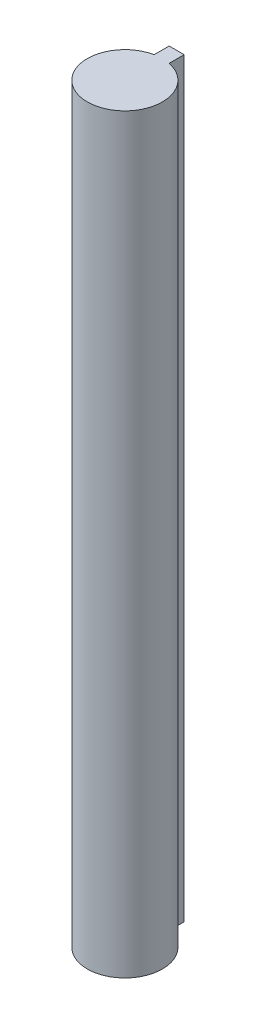
ISO-10303-21;
HEADER;
FILE_DESCRIPTION(('STEP AP214'),'2;1');
FILE_NAME('part.step','',(''),(''),'','','');
FILE_SCHEMA(('AUTOMOTIVE_DESIGN { 1 0 10303 214 1 1 1 1 }'));
ENDSEC;
DATA;
#1=APPLICATION_CONTEXT('core data for automotive mechanical design processes');
#2=APPLICATION_PROTOCOL_DEFINITION('international standard','automotive_design',2000,#1);
#3=PRODUCT_CONTEXT('',#1,'mechanical');
#4=PRODUCT('Part','Part','',(#3));
#5=PRODUCT_RELATED_PRODUCT_CATEGORY('part','',(#4));
#6=PRODUCT_DEFINITION_FORMATION('','',#4);
#7=PRODUCT_DEFINITION_CONTEXT('part definition',#1,'design');
#8=PRODUCT_DEFINITION('design','',#6,#7);
#9=PRODUCT_DEFINITION_SHAPE('','',#8);
#10=(LENGTH_UNIT() NAMED_UNIT(*) SI_UNIT(.MILLI.,.METRE.));
#11=(NAMED_UNIT(*) PLANE_ANGLE_UNIT() SI_UNIT($,.RADIAN.));
#12=(NAMED_UNIT(*) SI_UNIT($,.STERADIAN.) SOLID_ANGLE_UNIT());
#13=UNCERTAINTY_MEASURE_WITH_UNIT(LENGTH_MEASURE(1.E-05),#10,'distance_accuracy_value','');
#14=(GEOMETRIC_REPRESENTATION_CONTEXT(3) GLOBAL_UNCERTAINTY_ASSIGNED_CONTEXT((#13)) GLOBAL_UNIT_ASSIGNED_CONTEXT((#10,
#11,#12)) REPRESENTATION_CONTEXT('',''));
#15=CARTESIAN_POINT('',(0.,0.,0.));
#16=DIRECTION('',(0.,0.,1.));
#17=DIRECTION('',(1.,0.,0.));
#18=AXIS2_PLACEMENT_3D('',#15,#16,#17);
#19=CARTESIAN_POINT('',(0.,200.,0.));
#20=DIRECTION('',(0.,-1.,0.));
#21=DIRECTION('',(0.,0.,-1.));
#22=AXIS2_PLACEMENT_3D('',#19,#20,#21);
#23=CYLINDRICAL_SURFACE('',#22,10.);
#24=CARTESIAN_POINT('',(0.,0.,0.));
#25=DIRECTION('',(0.,1.,0.));
#26=DIRECTION('',(0.,0.,1.));
#27=AXIS2_PLACEMENT_3D('',#24,#25,#26);
#28=CIRCLE('',#27,10.);
#29=CARTESIAN_POINT('',(-2.,0.,-9.79795897113271));
#30=VERTEX_POINT('',#29);
#31=CARTESIAN_POINT('',(2.,0.,-9.79795897113271));
#32=VERTEX_POINT('',#31);
#33=EDGE_CURVE('E98',#30,#32,#28,.T.);
#34=ORIENTED_EDGE('',*,*,#33,.T.);
#35=DIRECTION('',(0.,-1.,0.));
#36=VECTOR('',#35,1.);
#37=CARTESIAN_POINT('',(2.,200.,-9.79795897113271));
#38=LINE('',#37,#36);
#39=CARTESIAN_POINT('',(2.,200.,-9.79795897113271));
#40=VERTEX_POINT('',#39);
#41=EDGE_CURVE('E11',#40,#32,#38,.T.);
#42=ORIENTED_EDGE('',*,*,#41,.F.);
#43=CARTESIAN_POINT('',(0.,200.,0.));
#44=DIRECTION('',(0.,1.,0.));
#45=DIRECTION('',(0.,0.,1.));
#46=AXIS2_PLACEMENT_3D('',#43,#44,#45);
#47=CIRCLE('',#46,10.);
#48=CARTESIAN_POINT('',(-2.,200.,-9.79795897113271));
#49=VERTEX_POINT('',#48);
#50=EDGE_CURVE('E86',#49,#40,#47,.T.);
#51=ORIENTED_EDGE('',*,*,#50,.F.);
#52=DIRECTION('',(0.,-1.,0.));
#53=VECTOR('',#52,1.);
#54=CARTESIAN_POINT('',(-2.,200.,-9.79795897113271));
#55=LINE('',#54,#53);
#56=EDGE_CURVE('E94',#49,#30,#55,.T.);
#57=ORIENTED_EDGE('',*,*,#56,.T.);
#58=EDGE_LOOP('',(#34,#42,#51,#57));
#59=FACE_BOUND('',#58,.T.);
#60=ADVANCED_FACE('F35',(#59),#23,.T.);
#61=CARTESIAN_POINT('',(2.,200.,-9.79795897113271));
#62=DIRECTION('',(-1.,0.,0.));
#63=DIRECTION('',(0.,0.,1.));
#64=AXIS2_PLACEMENT_3D('',#61,#62,#63);
#65=PLANE('',#64);
#66=DIRECTION('',(0.,0.,-1.));
#67=VECTOR('',#66,1.);
#68=CARTESIAN_POINT('',(2.,0.,-9.79795897113271));
#69=LINE('',#68,#67);
#70=CARTESIAN_POINT('',(2.,0.,-13.7979589711327));
#71=VERTEX_POINT('',#70);
#72=EDGE_CURVE('E90',#32,#71,#69,.T.);
#73=ORIENTED_EDGE('',*,*,#72,.T.);
#74=DIRECTION('',(0.,-1.,0.));
#75=VECTOR('',#74,1.);
#76=CARTESIAN_POINT('',(2.,200.,-13.7979589711327));
#77=LINE('',#76,#75);
#78=CARTESIAN_POINT('',(2.,200.,-13.7979589711327));
#79=VERTEX_POINT('',#78);
#80=EDGE_CURVE('E43',#79,#71,#77,.T.);
#81=ORIENTED_EDGE('',*,*,#80,.F.);
#82=DIRECTION('',(0.,0.,-1.));
#83=VECTOR('',#82,1.);
#84=CARTESIAN_POINT('',(2.,200.,-9.79795897113271));
#85=LINE('',#84,#83);
#86=EDGE_CURVE('E81',#40,#79,#85,.T.);
#87=ORIENTED_EDGE('',*,*,#86,.F.);
#88=ORIENTED_EDGE('',*,*,#41,.T.);
#89=EDGE_LOOP('',(#73,#81,#87,#88));
#90=FACE_BOUND('',#89,.T.);
#91=ADVANCED_FACE('F89',(#90),#65,.F.);
#92=CARTESIAN_POINT('',(-2.,200.,-13.7979589711327));
#93=DIRECTION('',(0.,0.,1.));
#94=DIRECTION('',(1.,0.,0.));
#95=AXIS2_PLACEMENT_3D('',#92,#93,#94);
#96=PLANE('',#95);
#97=DIRECTION('',(-1.,0.,0.));
#98=VECTOR('',#97,1.);
#99=CARTESIAN_POINT('',(-2.,0.,-13.7979589711327));
#100=LINE('',#99,#98);
#101=CARTESIAN_POINT('',(-2.,0.,-13.7979589711327));
#102=VERTEX_POINT('',#101);
#103=EDGE_CURVE('E68',#71,#102,#100,.T.);
#104=ORIENTED_EDGE('',*,*,#103,.T.);
#105=DIRECTION('',(0.,-1.,0.));
#106=VECTOR('',#105,1.);
#107=CARTESIAN_POINT('',(-2.,200.,-13.7979589711327));
#108=LINE('',#107,#106);
#109=CARTESIAN_POINT('',(-2.,200.,-13.7979589711327));
#110=VERTEX_POINT('',#109);
#111=EDGE_CURVE('E91',#110,#102,#108,.T.);
#112=ORIENTED_EDGE('',*,*,#111,.F.);
#113=DIRECTION('',(-1.,0.,0.));
#114=VECTOR('',#113,1.);
#115=CARTESIAN_POINT('',(-2.,200.,-13.7979589711327));
#116=LINE('',#115,#114);
#117=EDGE_CURVE('E84',#79,#110,#116,.T.);
#118=ORIENTED_EDGE('',*,*,#117,.F.);
#119=ORIENTED_EDGE('',*,*,#80,.T.);
#120=EDGE_LOOP('',(#104,#112,#118,#119));
#121=FACE_BOUND('',#120,.T.);
#122=ADVANCED_FACE('F92',(#121),#96,.F.);
#123=CARTESIAN_POINT('',(-2.,200.,-9.79795897113271));
#124=DIRECTION('',(1.,0.,0.));
#125=DIRECTION('',(0.,0.,-1.));
#126=AXIS2_PLACEMENT_3D('',#123,#124,#125);
#127=PLANE('',#126);
#128=DIRECTION('',(0.,0.,1.));
#129=VECTOR('',#128,1.);
#130=CARTESIAN_POINT('',(-2.,0.,-9.79795897113271));
#131=LINE('',#130,#129);
#132=EDGE_CURVE('E74',#102,#30,#131,.T.);
#133=ORIENTED_EDGE('',*,*,#132,.T.);
#134=ORIENTED_EDGE('',*,*,#56,.F.);
#135=DIRECTION('',(0.,0.,1.));
#136=VECTOR('',#135,1.);
#137=CARTESIAN_POINT('',(-2.,200.,-9.79795897113271));
#138=LINE('',#137,#136);
#139=EDGE_CURVE('E51',#110,#49,#138,.T.);
#140=ORIENTED_EDGE('',*,*,#139,.F.);
#141=ORIENTED_EDGE('',*,*,#111,.T.);
#142=EDGE_LOOP('',(#133,#134,#140,#141));
#143=FACE_BOUND('',#142,.T.);
#144=ADVANCED_FACE('F105',(#143),#127,.F.);
#145=CARTESIAN_POINT('',(0.,200.,0.));
#146=DIRECTION('',(0.,1.,0.));
#147=DIRECTION('',(0.,0.,1.));
#148=AXIS2_PLACEMENT_3D('',#145,#146,#147);
#149=PLANE('',#148);
#150=ORIENTED_EDGE('',*,*,#50,.T.);
#151=ORIENTED_EDGE('',*,*,#86,.T.);
#152=ORIENTED_EDGE('',*,*,#117,.T.);
#153=ORIENTED_EDGE('',*,*,#139,.T.);
#154=EDGE_LOOP('',(#150,#151,#152,#153));
#155=FACE_BOUND('',#154,.T.);
#156=ADVANCED_FACE('F82',(#155),#149,.T.);
#157=CARTESIAN_POINT('',(0.,0.,0.));
#158=DIRECTION('',(0.,1.,0.));
#159=DIRECTION('',(0.,0.,1.));
#160=AXIS2_PLACEMENT_3D('',#157,#158,#159);
#161=PLANE('',#160);
#162=ORIENTED_EDGE('',*,*,#33,.F.);
#163=ORIENTED_EDGE('',*,*,#132,.F.);
#164=ORIENTED_EDGE('',*,*,#103,.F.);
#165=ORIENTED_EDGE('',*,*,#72,.F.);
#166=EDGE_LOOP('',(#162,#163,#164,#165));
#167=FACE_BOUND('',#166,.T.);
#168=ADVANCED_FACE('F108',(#167),#161,.F.);
#169=CLOSED_SHELL('',(#60,#91,#122,#144,#156,#168));
#170=MANIFOLD_SOLID_BREP('B2',#169);
#171=ADVANCED_BREP_SHAPE_REPRESENTATION('',(#18,#170),#14);
#172=SHAPE_DEFINITION_REPRESENTATION(#9,#171);
ENDSEC;
END-ISO-10303-21;
